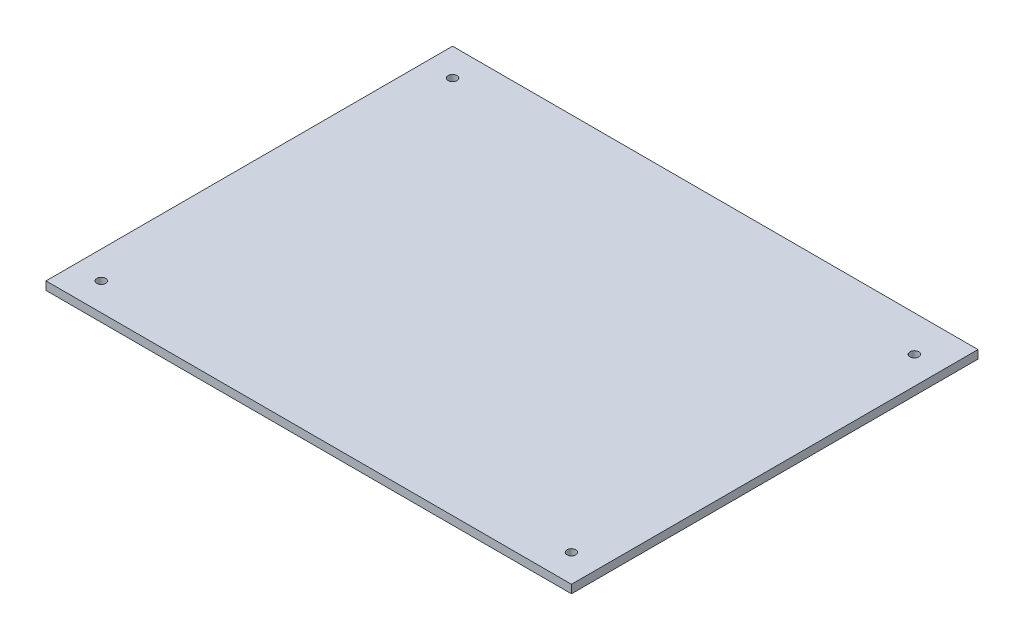
ISO-10303-21;
HEADER;
FILE_DESCRIPTION(('STEP AP214'),'2;1');
FILE_NAME('part.step','',(''),(''),'','','');
FILE_SCHEMA(('AUTOMOTIVE_DESIGN { 1 0 10303 214 1 1 1 1 }'));
ENDSEC;
DATA;
#1=APPLICATION_CONTEXT('core data for automotive mechanical design processes');
#2=APPLICATION_PROTOCOL_DEFINITION('international standard','automotive_design',2000,#1);
#3=PRODUCT_CONTEXT('',#1,'mechanical');
#4=PRODUCT('Part','Part','',(#3));
#5=PRODUCT_RELATED_PRODUCT_CATEGORY('part','',(#4));
#6=PRODUCT_DEFINITION_FORMATION('','',#4);
#7=PRODUCT_DEFINITION_CONTEXT('part definition',#1,'design');
#8=PRODUCT_DEFINITION('design','',#6,#7);
#9=PRODUCT_DEFINITION_SHAPE('','',#8);
#10=(LENGTH_UNIT() NAMED_UNIT(*) SI_UNIT(.MILLI.,.METRE.));
#11=(NAMED_UNIT(*) PLANE_ANGLE_UNIT() SI_UNIT($,.RADIAN.));
#12=(NAMED_UNIT(*) SI_UNIT($,.STERADIAN.) SOLID_ANGLE_UNIT());
#13=UNCERTAINTY_MEASURE_WITH_UNIT(LENGTH_MEASURE(1.E-05),#10,'distance_accuracy_value','');
#14=(GEOMETRIC_REPRESENTATION_CONTEXT(3) GLOBAL_UNCERTAINTY_ASSIGNED_CONTEXT((#13)) GLOBAL_UNIT_ASSIGNED_CONTEXT((#10,
#11,#12)) REPRESENTATION_CONTEXT('',''));
#15=CARTESIAN_POINT('',(0.,0.,0.));
#16=DIRECTION('',(0.,0.,1.));
#17=DIRECTION('',(1.,0.,0.));
#18=AXIS2_PLACEMENT_3D('',#15,#16,#17);
#19=CARTESIAN_POINT('',(0.,-3.,0.));
#20=DIRECTION('',(-1.,0.,0.));
#21=DIRECTION('',(0.,0.,1.));
#22=AXIS2_PLACEMENT_3D('',#19,#20,#21);
#23=PLANE('',#22);
#24=DIRECTION('',(0.,0.,1.));
#25=VECTOR('',#24,1.);
#26=CARTESIAN_POINT('',(0.,0.,0.));
#27=LINE('',#26,#25);
#28=CARTESIAN_POINT('',(0.,0.,-147.));
#29=VERTEX_POINT('',#28);
#30=CARTESIAN_POINT('',(0.,0.,0.));
#31=VERTEX_POINT('',#30);
#32=EDGE_CURVE('E100',#29,#31,#27,.T.);
#33=ORIENTED_EDGE('',*,*,#32,.F.);
#34=DIRECTION('',(0.,1.,0.));
#35=VECTOR('',#34,1.);
#36=CARTESIAN_POINT('',(0.,-3.,-147.));
#37=LINE('',#36,#35);
#38=CARTESIAN_POINT('',(0.,-3.,-147.));
#39=VERTEX_POINT('',#38);
#40=EDGE_CURVE('E11',#39,#29,#37,.T.);
#41=ORIENTED_EDGE('',*,*,#40,.F.);
#42=DIRECTION('',(0.,0.,1.));
#43=VECTOR('',#42,1.);
#44=CARTESIAN_POINT('',(0.,-3.,0.));
#45=LINE('',#44,#43);
#46=CARTESIAN_POINT('',(0.,-3.,0.));
#47=VERTEX_POINT('',#46);
#48=EDGE_CURVE('E93',#39,#47,#45,.T.);
#49=ORIENTED_EDGE('',*,*,#48,.T.);
#50=DIRECTION('',(0.,1.,0.));
#51=VECTOR('',#50,1.);
#52=CARTESIAN_POINT('',(0.,-3.,0.));
#53=LINE('',#52,#51);
#54=EDGE_CURVE('E38',#47,#31,#53,.T.);
#55=ORIENTED_EDGE('',*,*,#54,.T.);
#56=EDGE_LOOP('',(#33,#41,#49,#55));
#57=FACE_BOUND('',#56,.T.);
#58=ADVANCED_FACE('F35',(#57),#23,.T.);
#59=CARTESIAN_POINT('',(0.,-3.,-147.));
#60=DIRECTION('',(0.,0.,-1.));
#61=DIRECTION('',(-1.,0.,0.));
#62=AXIS2_PLACEMENT_3D('',#59,#60,#61);
#63=PLANE('',#62);
#64=DIRECTION('',(-1.,0.,0.));
#65=VECTOR('',#64,1.);
#66=CARTESIAN_POINT('',(0.,0.,-147.));
#67=LINE('',#66,#65);
#68=CARTESIAN_POINT('',(190.,0.,-147.));
#69=VERTEX_POINT('',#68);
#70=EDGE_CURVE('E95',#69,#29,#67,.T.);
#71=ORIENTED_EDGE('',*,*,#70,.F.);
#72=DIRECTION('',(0.,1.,0.));
#73=VECTOR('',#72,1.);
#74=CARTESIAN_POINT('',(190.,-3.,-147.));
#75=LINE('',#74,#73);
#76=CARTESIAN_POINT('',(190.,-3.,-147.));
#77=VERTEX_POINT('',#76);
#78=EDGE_CURVE('E44',#77,#69,#75,.T.);
#79=ORIENTED_EDGE('',*,*,#78,.F.);
#80=DIRECTION('',(-1.,0.,0.));
#81=VECTOR('',#80,1.);
#82=CARTESIAN_POINT('',(0.,-3.,-147.));
#83=LINE('',#82,#81);
#84=EDGE_CURVE('E90',#77,#39,#83,.T.);
#85=ORIENTED_EDGE('',*,*,#84,.T.);
#86=ORIENTED_EDGE('',*,*,#40,.T.);
#87=EDGE_LOOP('',(#71,#79,#85,#86));
#88=FACE_BOUND('',#87,.T.);
#89=ADVANCED_FACE('F111',(#88),#63,.T.);
#90=CARTESIAN_POINT('',(190.,-3.,0.));
#91=DIRECTION('',(1.,0.,0.));
#92=DIRECTION('',(0.,0.,-1.));
#93=AXIS2_PLACEMENT_3D('',#90,#91,#92);
#94=PLANE('',#93);
#95=DIRECTION('',(0.,0.,-1.));
#96=VECTOR('',#95,1.);
#97=CARTESIAN_POINT('',(190.,0.,0.));
#98=LINE('',#97,#96);
#99=CARTESIAN_POINT('',(190.,0.,0.));
#100=VERTEX_POINT('',#99);
#101=EDGE_CURVE('E85',#100,#69,#98,.T.);
#102=ORIENTED_EDGE('',*,*,#101,.F.);
#103=DIRECTION('',(0.,1.,0.));
#104=VECTOR('',#103,1.);
#105=CARTESIAN_POINT('',(190.,-3.,0.));
#106=LINE('',#105,#104);
#107=CARTESIAN_POINT('',(190.,-3.,0.));
#108=VERTEX_POINT('',#107);
#109=EDGE_CURVE('E80',#108,#100,#106,.T.);
#110=ORIENTED_EDGE('',*,*,#109,.F.);
#111=DIRECTION('',(0.,0.,-1.));
#112=VECTOR('',#111,1.);
#113=CARTESIAN_POINT('',(190.,-3.,0.));
#114=LINE('',#113,#112);
#115=EDGE_CURVE('E83',#108,#77,#114,.T.);
#116=ORIENTED_EDGE('',*,*,#115,.T.);
#117=ORIENTED_EDGE('',*,*,#78,.T.);
#118=EDGE_LOOP('',(#102,#110,#116,#117));
#119=FACE_BOUND('',#118,.T.);
#120=ADVANCED_FACE('F82',(#119),#94,.T.);
#121=CARTESIAN_POINT('',(0.,-3.,0.));
#122=DIRECTION('',(0.,0.,1.));
#123=DIRECTION('',(1.,0.,0.));
#124=AXIS2_PLACEMENT_3D('',#121,#122,#123);
#125=PLANE('',#124);
#126=DIRECTION('',(1.,0.,0.));
#127=VECTOR('',#126,1.);
#128=CARTESIAN_POINT('',(0.,0.,0.));
#129=LINE('',#128,#127);
#130=EDGE_CURVE('E103',#31,#100,#129,.T.);
#131=ORIENTED_EDGE('',*,*,#130,.F.);
#132=ORIENTED_EDGE('',*,*,#54,.F.);
#133=DIRECTION('',(1.,0.,0.));
#134=VECTOR('',#133,1.);
#135=CARTESIAN_POINT('',(0.,-3.,0.));
#136=LINE('',#135,#134);
#137=EDGE_CURVE('E89',#47,#108,#136,.T.);
#138=ORIENTED_EDGE('',*,*,#137,.T.);
#139=ORIENTED_EDGE('',*,*,#109,.T.);
#140=EDGE_LOOP('',(#131,#132,#138,#139));
#141=FACE_BOUND('',#140,.T.);
#142=ADVANCED_FACE('F92',(#141),#125,.T.);
#143=CARTESIAN_POINT('',(0.,-3.,0.));
#144=DIRECTION('',(0.,-1.,0.));
#145=DIRECTION('',(0.,0.,-1.));
#146=AXIS2_PLACEMENT_3D('',#143,#144,#145);
#147=PLANE('',#146);
#148=CARTESIAN_POINT('',(180.,-3.,-134.));
#149=DIRECTION('',(0.,1.,0.));
#150=DIRECTION('',(0.,0.,1.));
#151=AXIS2_PLACEMENT_3D('',#148,#149,#150);
#152=CIRCLE('',#151,1.59999999999999);
#153=CARTESIAN_POINT('',(180.,-3.,-132.4));
#154=VERTEX_POINT('',#153);
#155=EDGE_CURVE('E152',#154,#154,#152,.T.);
#156=ORIENTED_EDGE('',*,*,#155,.T.);
#157=EDGE_LOOP('',(#156));
#158=FACE_BOUND('',#157,.T.);
#159=CARTESIAN_POINT('',(10.,-3.,-137.));
#160=DIRECTION('',(0.,1.,0.));
#161=DIRECTION('',(0.,0.,1.));
#162=AXIS2_PLACEMENT_3D('',#159,#160,#161);
#163=CIRCLE('',#162,1.59999999999999);
#164=CARTESIAN_POINT('',(10.,-3.,-135.4));
#165=VERTEX_POINT('',#164);
#166=EDGE_CURVE('E160',#165,#165,#163,.T.);
#167=ORIENTED_EDGE('',*,*,#166,.T.);
#168=EDGE_LOOP('',(#167));
#169=FACE_BOUND('',#168,.T.);
#170=CARTESIAN_POINT('',(180.,-3.,-10.));
#171=DIRECTION('',(0.,1.,0.));
#172=DIRECTION('',(0.,0.,1.));
#173=AXIS2_PLACEMENT_3D('',#170,#171,#172);
#174=CIRCLE('',#173,1.59999999999999);
#175=CARTESIAN_POINT('',(180.,-3.,-8.40000000000001));
#176=VERTEX_POINT('',#175);
#177=EDGE_CURVE('E166',#176,#176,#174,.T.);
#178=ORIENTED_EDGE('',*,*,#177,.T.);
#179=EDGE_LOOP('',(#178));
#180=FACE_BOUND('',#179,.T.);
#181=CARTESIAN_POINT('',(10.,-3.,-10.));
#182=DIRECTION('',(0.,1.,0.));
#183=DIRECTION('',(0.,0.,1.));
#184=AXIS2_PLACEMENT_3D('',#181,#182,#183);
#185=CIRCLE('',#184,1.6);
#186=CARTESIAN_POINT('',(10.,-3.,-8.4));
#187=VERTEX_POINT('',#186);
#188=EDGE_CURVE('E104',#187,#187,#185,.T.);
#189=ORIENTED_EDGE('',*,*,#188,.T.);
#190=EDGE_LOOP('',(#189));
#191=FACE_BOUND('',#190,.T.);
#192=ORIENTED_EDGE('',*,*,#48,.F.);
#193=ORIENTED_EDGE('',*,*,#84,.F.);
#194=ORIENTED_EDGE('',*,*,#115,.F.);
#195=ORIENTED_EDGE('',*,*,#137,.F.);
#196=EDGE_LOOP('',(#192,#193,#194,#195));
#197=FACE_BOUND('',#196,.T.);
#198=ADVANCED_FACE('F88',(#158,#169,#180,#191,#197),#147,.T.);
#199=CARTESIAN_POINT('',(0.,0.,0.));
#200=DIRECTION('',(0.,-1.,0.));
#201=DIRECTION('',(0.,0.,-1.));
#202=AXIS2_PLACEMENT_3D('',#199,#200,#201);
#203=PLANE('',#202);
#204=CARTESIAN_POINT('',(180.,0.,-134.));
#205=DIRECTION('',(0.,1.,0.));
#206=DIRECTION('',(0.,0.,1.));
#207=AXIS2_PLACEMENT_3D('',#204,#205,#206);
#208=CIRCLE('',#207,1.59999999999999);
#209=CARTESIAN_POINT('',(180.,0.,-132.4));
#210=VERTEX_POINT('',#209);
#211=EDGE_CURVE('E155',#210,#210,#208,.T.);
#212=ORIENTED_EDGE('',*,*,#211,.F.);
#213=EDGE_LOOP('',(#212));
#214=FACE_BOUND('',#213,.T.);
#215=CARTESIAN_POINT('',(10.,0.,-137.));
#216=DIRECTION('',(0.,1.,0.));
#217=DIRECTION('',(0.,0.,1.));
#218=AXIS2_PLACEMENT_3D('',#215,#216,#217);
#219=CIRCLE('',#218,1.59999999999999);
#220=CARTESIAN_POINT('',(10.,0.,-135.4));
#221=VERTEX_POINT('',#220);
#222=EDGE_CURVE('E157',#221,#221,#219,.T.);
#223=ORIENTED_EDGE('',*,*,#222,.F.);
#224=EDGE_LOOP('',(#223));
#225=FACE_BOUND('',#224,.T.);
#226=CARTESIAN_POINT('',(180.,0.,-10.));
#227=DIRECTION('',(0.,1.,0.));
#228=DIRECTION('',(0.,0.,1.));
#229=AXIS2_PLACEMENT_3D('',#226,#227,#228);
#230=CIRCLE('',#229,1.59999999999999);
#231=CARTESIAN_POINT('',(180.,0.,-8.40000000000001));
#232=VERTEX_POINT('',#231);
#233=EDGE_CURVE('E163',#232,#232,#230,.T.);
#234=ORIENTED_EDGE('',*,*,#233,.F.);
#235=EDGE_LOOP('',(#234));
#236=FACE_BOUND('',#235,.T.);
#237=CARTESIAN_POINT('',(10.,0.,-10.));
#238=DIRECTION('',(0.,1.,0.));
#239=DIRECTION('',(0.,0.,1.));
#240=AXIS2_PLACEMENT_3D('',#237,#238,#239);
#241=CIRCLE('',#240,1.6);
#242=CARTESIAN_POINT('',(10.,0.,-8.4));
#243=VERTEX_POINT('',#242);
#244=EDGE_CURVE('E169',#243,#243,#241,.T.);
#245=ORIENTED_EDGE('',*,*,#244,.F.);
#246=EDGE_LOOP('',(#245));
#247=FACE_BOUND('',#246,.T.);
#248=ORIENTED_EDGE('',*,*,#32,.T.);
#249=ORIENTED_EDGE('',*,*,#130,.T.);
#250=ORIENTED_EDGE('',*,*,#101,.T.);
#251=ORIENTED_EDGE('',*,*,#70,.T.);
#252=EDGE_LOOP('',(#248,#249,#250,#251));
#253=FACE_BOUND('',#252,.T.);
#254=ADVANCED_FACE('F110',(#214,#225,#236,#247,#253),#203,.F.);
#255=CARTESIAN_POINT('',(10.,-3.,-10.));
#256=DIRECTION('',(0.,1.,0.));
#257=DIRECTION('',(0.,0.,1.));
#258=AXIS2_PLACEMENT_3D('',#255,#256,#257);
#259=CYLINDRICAL_SURFACE('',#258,1.6);
#260=ORIENTED_EDGE('',*,*,#188,.F.);
#261=EDGE_LOOP('',(#260));
#262=FACE_BOUND('',#261,.T.);
#263=ORIENTED_EDGE('',*,*,#244,.T.);
#264=EDGE_LOOP('',(#263));
#265=FACE_BOUND('',#264,.T.);
#266=ADVANCED_FACE('F129',(#262,#265),#259,.F.);
#267=CARTESIAN_POINT('',(180.,-3.,-10.));
#268=DIRECTION('',(0.,1.,0.));
#269=DIRECTION('',(0.,0.,1.));
#270=AXIS2_PLACEMENT_3D('',#267,#268,#269);
#271=CYLINDRICAL_SURFACE('',#270,1.59999999999999);
#272=ORIENTED_EDGE('',*,*,#177,.F.);
#273=EDGE_LOOP('',(#272));
#274=FACE_BOUND('',#273,.T.);
#275=ORIENTED_EDGE('',*,*,#233,.T.);
#276=EDGE_LOOP('',(#275));
#277=FACE_BOUND('',#276,.T.);
#278=ADVANCED_FACE('F136',(#274,#277),#271,.F.);
#279=CARTESIAN_POINT('',(10.,-3.,-137.));
#280=DIRECTION('',(0.,1.,0.));
#281=DIRECTION('',(0.,0.,1.));
#282=AXIS2_PLACEMENT_3D('',#279,#280,#281);
#283=CYLINDRICAL_SURFACE('',#282,1.59999999999999);
#284=ORIENTED_EDGE('',*,*,#166,.F.);
#285=EDGE_LOOP('',(#284));
#286=FACE_BOUND('',#285,.T.);
#287=ORIENTED_EDGE('',*,*,#222,.T.);
#288=EDGE_LOOP('',(#287));
#289=FACE_BOUND('',#288,.T.);
#290=ADVANCED_FACE('F140',(#286,#289),#283,.F.);
#291=CARTESIAN_POINT('',(180.,-3.,-134.));
#292=DIRECTION('',(0.,1.,0.));
#293=DIRECTION('',(0.,0.,1.));
#294=AXIS2_PLACEMENT_3D('',#291,#292,#293);
#295=CYLINDRICAL_SURFACE('',#294,1.59999999999999);
#296=ORIENTED_EDGE('',*,*,#155,.F.);
#297=EDGE_LOOP('',(#296));
#298=FACE_BOUND('',#297,.T.);
#299=ORIENTED_EDGE('',*,*,#211,.T.);
#300=EDGE_LOOP('',(#299));
#301=FACE_BOUND('',#300,.T.);
#302=ADVANCED_FACE('F144',(#298,#301),#295,.F.);
#303=CLOSED_SHELL('',(#58,#89,#120,#142,#198,#254,#266,#278,#290,#302));
#304=MANIFOLD_SOLID_BREP('B2',#303);
#305=ADVANCED_BREP_SHAPE_REPRESENTATION('',(#18,#304),#14);
#306=SHAPE_DEFINITION_REPRESENTATION(#9,#305);
ENDSEC;
END-ISO-10303-21;
